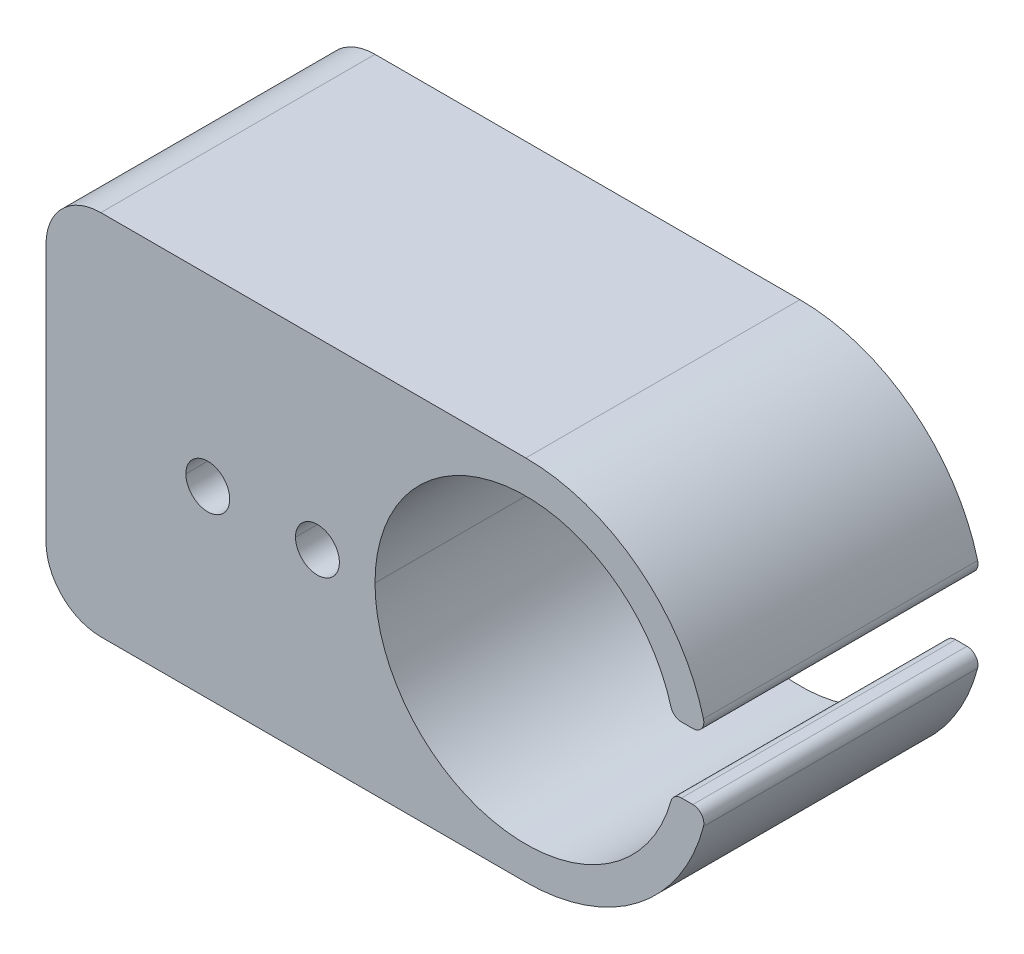
ISO-10303-21;
HEADER;
FILE_DESCRIPTION(('STEP AP214'),'2;1');
FILE_NAME('part.step','',(''),(''),'','','');
FILE_SCHEMA(('AUTOMOTIVE_DESIGN { 1 0 10303 214 1 1 1 1 }'));
ENDSEC;
DATA;
#1=APPLICATION_CONTEXT('core data for automotive mechanical design processes');
#2=APPLICATION_PROTOCOL_DEFINITION('international standard','automotive_design',2000,#1);
#3=PRODUCT_CONTEXT('',#1,'mechanical');
#4=PRODUCT('Part','Part','',(#3));
#5=PRODUCT_RELATED_PRODUCT_CATEGORY('part','',(#4));
#6=PRODUCT_DEFINITION_FORMATION('','',#4);
#7=PRODUCT_DEFINITION_CONTEXT('part definition',#1,'design');
#8=PRODUCT_DEFINITION('design','',#6,#7);
#9=PRODUCT_DEFINITION_SHAPE('','',#8);
#10=(LENGTH_UNIT() NAMED_UNIT(*) SI_UNIT(.MILLI.,.METRE.));
#11=(NAMED_UNIT(*) PLANE_ANGLE_UNIT() SI_UNIT($,.RADIAN.));
#12=(NAMED_UNIT(*) SI_UNIT($,.STERADIAN.) SOLID_ANGLE_UNIT());
#13=UNCERTAINTY_MEASURE_WITH_UNIT(LENGTH_MEASURE(1.E-05),#10,'distance_accuracy_value','');
#14=(GEOMETRIC_REPRESENTATION_CONTEXT(3) GLOBAL_UNCERTAINTY_ASSIGNED_CONTEXT((#13)) GLOBAL_UNIT_ASSIGNED_CONTEXT((#10,
#11,#12)) REPRESENTATION_CONTEXT('',''));
#15=CARTESIAN_POINT('',(0.,0.,0.));
#16=DIRECTION('',(0.,0.,1.));
#17=DIRECTION('',(1.,0.,0.));
#18=AXIS2_PLACEMENT_3D('',#15,#16,#17);
#19=CARTESIAN_POINT('',(14.1972708645007,4.,25.));
#20=DIRECTION('',(0.,0.,-1.));
#21=DIRECTION('',(-1.,0.,0.));
#22=AXIS2_PLACEMENT_3D('',#19,#20,#21);
#23=CYLINDRICAL_SURFACE('',#22,1.);
#24=CARTESIAN_POINT('',(14.1972708645007,4.,25.));
#25=DIRECTION('',(0.,0.,1.));
#26=DIRECTION('',(1.,0.,0.));
#27=AXIS2_PLACEMENT_3D('',#24,#25,#26);
#28=CIRCLE('',#27,1.);
#29=CARTESIAN_POINT('',(13.2347440262294,3.72881355932204,25.));
#30=VERTEX_POINT('',#29);
#31=CARTESIAN_POINT('',(14.1972708645007,3.,25.));
#32=VERTEX_POINT('',#31);
#33=EDGE_CURVE('E337',#30,#32,#28,.T.);
#34=ORIENTED_EDGE('',*,*,#33,.F.);
#35=DIRECTION('',(0.,0.,1.));
#36=VECTOR('',#35,1.);
#37=CARTESIAN_POINT('',(13.2347440262294,3.72881355932204,25.));
#38=LINE('',#37,#36);
#39=CARTESIAN_POINT('',(13.2347440262294,3.72881355932204,0.));
#40=VERTEX_POINT('',#39);
#41=EDGE_CURVE('E293',#40,#30,#38,.T.);
#42=ORIENTED_EDGE('',*,*,#41,.F.);
#43=CARTESIAN_POINT('',(14.1972708645007,4.,0.));
#44=DIRECTION('',(0.,0.,-1.));
#45=DIRECTION('',(1.,0.,0.));
#46=AXIS2_PLACEMENT_3D('',#43,#44,#45);
#47=CIRCLE('',#46,1.);
#48=CARTESIAN_POINT('',(14.1972708645007,3.,0.));
#49=VERTEX_POINT('',#48);
#50=EDGE_CURVE('E383',#49,#40,#47,.T.);
#51=ORIENTED_EDGE('',*,*,#50,.F.);
#52=DIRECTION('',(0.,0.,-1.));
#53=VECTOR('',#52,1.);
#54=CARTESIAN_POINT('',(14.1972708645007,3.,25.));
#55=LINE('',#54,#53);
#56=EDGE_CURVE('E52',#32,#49,#55,.T.);
#57=ORIENTED_EDGE('',*,*,#56,.F.);
#58=EDGE_LOOP('',(#34,#42,#51,#57));
#59=FACE_BOUND('',#58,.T.);
#60=ADVANCED_FACE('F17',(#59),#23,.T.);
#61=CARTESIAN_POINT('',(14.1972708645007,-4.,25.));
#62=DIRECTION('',(0.,0.,-1.));
#63=DIRECTION('',(-1.,0.,0.));
#64=AXIS2_PLACEMENT_3D('',#61,#62,#63);
#65=CYLINDRICAL_SURFACE('',#64,1.);
#66=CARTESIAN_POINT('',(14.1972708645007,-4.,25.));
#67=DIRECTION('',(0.,0.,1.));
#68=DIRECTION('',(1.,0.,0.));
#69=AXIS2_PLACEMENT_3D('',#66,#67,#68);
#70=CIRCLE('',#69,1.);
#71=CARTESIAN_POINT('',(14.1972708645007,-3.,25.));
#72=VERTEX_POINT('',#71);
#73=CARTESIAN_POINT('',(13.2347440262294,-3.72881355932204,25.));
#74=VERTEX_POINT('',#73);
#75=EDGE_CURVE('E374',#72,#74,#70,.T.);
#76=ORIENTED_EDGE('',*,*,#75,.F.);
#77=DIRECTION('',(0.,0.,1.));
#78=VECTOR('',#77,1.);
#79=CARTESIAN_POINT('',(14.1972708645007,-3.,25.));
#80=LINE('',#79,#78);
#81=CARTESIAN_POINT('',(14.1972708645007,-3.,0.));
#82=VERTEX_POINT('',#81);
#83=EDGE_CURVE('E21',#82,#72,#80,.T.);
#84=ORIENTED_EDGE('',*,*,#83,.F.);
#85=CARTESIAN_POINT('',(14.1972708645007,-4.,0.));
#86=DIRECTION('',(0.,0.,-1.));
#87=DIRECTION('',(1.,0.,0.));
#88=AXIS2_PLACEMENT_3D('',#85,#86,#87);
#89=CIRCLE('',#88,1.);
#90=CARTESIAN_POINT('',(13.2347440262294,-3.72881355932204,0.));
#91=VERTEX_POINT('',#90);
#92=EDGE_CURVE('E443',#91,#82,#89,.T.);
#93=ORIENTED_EDGE('',*,*,#92,.F.);
#94=DIRECTION('',(0.,0.,-1.));
#95=VECTOR('',#94,1.);
#96=CARTESIAN_POINT('',(13.2347440262294,-3.72881355932204,25.));
#97=LINE('',#96,#95);
#98=EDGE_CURVE('E41',#74,#91,#97,.T.);
#99=ORIENTED_EDGE('',*,*,#98,.F.);
#100=EDGE_LOOP('',(#76,#84,#93,#99));
#101=FACE_BOUND('',#100,.T.);
#102=ADVANCED_FACE('F508',(#101),#65,.T.);
#103=CARTESIAN_POINT('',(15.2335977365821,4.,25.));
#104=DIRECTION('',(0.,0.,-1.));
#105=DIRECTION('',(-1.,0.,0.));
#106=AXIS2_PLACEMENT_3D('',#103,#104,#105);
#107=CYLINDRICAL_SURFACE('',#106,1.);
#108=CARTESIAN_POINT('',(15.2335977365821,4.,25.));
#109=DIRECTION('',(0.,0.,1.));
#110=DIRECTION('',(1.,0.,0.));
#111=AXIS2_PLACEMENT_3D('',#108,#109,#110);
#112=CIRCLE('',#111,1.);
#113=CARTESIAN_POINT('',(15.2335977365821,3.,25.));
#114=VERTEX_POINT('',#113);
#115=CARTESIAN_POINT('',(16.2008102912857,4.25396825396826,25.));
#116=VERTEX_POINT('',#115);
#117=EDGE_CURVE('E336',#114,#116,#112,.T.);
#118=ORIENTED_EDGE('',*,*,#117,.F.);
#119=DIRECTION('',(0.,0.,1.));
#120=VECTOR('',#119,1.);
#121=CARTESIAN_POINT('',(15.2335977365821,3.,25.));
#122=LINE('',#121,#120);
#123=CARTESIAN_POINT('',(15.2335977365821,3.,0.));
#124=VERTEX_POINT('',#123);
#125=EDGE_CURVE('E344',#124,#114,#122,.T.);
#126=ORIENTED_EDGE('',*,*,#125,.F.);
#127=CARTESIAN_POINT('',(15.2335977365821,4.,0.));
#128=DIRECTION('',(0.,0.,-1.));
#129=DIRECTION('',(1.,0.,0.));
#130=AXIS2_PLACEMENT_3D('',#127,#128,#129);
#131=CIRCLE('',#130,1.);
#132=CARTESIAN_POINT('',(16.2008102912857,4.25396825396826,0.));
#133=VERTEX_POINT('',#132);
#134=EDGE_CURVE('E319',#133,#124,#131,.T.);
#135=ORIENTED_EDGE('',*,*,#134,.F.);
#136=DIRECTION('',(0.,0.,-1.));
#137=VECTOR('',#136,1.);
#138=CARTESIAN_POINT('',(16.2008102912857,4.25396825396826,25.));
#139=LINE('',#138,#137);
#140=EDGE_CURVE('E453',#116,#133,#139,.T.);
#141=ORIENTED_EDGE('',*,*,#140,.F.);
#142=EDGE_LOOP('',(#118,#126,#135,#141));
#143=FACE_BOUND('',#142,.T.);
#144=ADVANCED_FACE('F521',(#143),#107,.T.);
#145=CARTESIAN_POINT('',(15.2335977365821,-4.,25.));
#146=DIRECTION('',(0.,0.,-1.));
#147=DIRECTION('',(-1.,0.,0.));
#148=AXIS2_PLACEMENT_3D('',#145,#146,#147);
#149=CYLINDRICAL_SURFACE('',#148,1.);
#150=CARTESIAN_POINT('',(15.2335977365821,-4.,25.));
#151=DIRECTION('',(0.,0.,1.));
#152=DIRECTION('',(1.,0.,0.));
#153=AXIS2_PLACEMENT_3D('',#150,#151,#152);
#154=CIRCLE('',#153,1.);
#155=CARTESIAN_POINT('',(16.2008102912857,-4.25396825396826,25.));
#156=VERTEX_POINT('',#155);
#157=CARTESIAN_POINT('',(15.2335977365821,-3.,25.));
#158=VERTEX_POINT('',#157);
#159=EDGE_CURVE('E362',#156,#158,#154,.T.);
#160=ORIENTED_EDGE('',*,*,#159,.F.);
#161=DIRECTION('',(0.,0.,1.));
#162=VECTOR('',#161,1.);
#163=CARTESIAN_POINT('',(16.2008102912857,-4.25396825396826,25.));
#164=LINE('',#163,#162);
#165=CARTESIAN_POINT('',(16.2008102912857,-4.25396825396826,0.));
#166=VERTEX_POINT('',#165);
#167=EDGE_CURVE('E405',#166,#156,#164,.T.);
#168=ORIENTED_EDGE('',*,*,#167,.F.);
#169=CARTESIAN_POINT('',(15.2335977365821,-4.,0.));
#170=DIRECTION('',(0.,0.,-1.));
#171=DIRECTION('',(1.,0.,0.));
#172=AXIS2_PLACEMENT_3D('',#169,#170,#171);
#173=CIRCLE('',#172,1.);
#174=CARTESIAN_POINT('',(15.2335977365821,-3.,0.));
#175=VERTEX_POINT('',#174);
#176=EDGE_CURVE('E419',#175,#166,#173,.T.);
#177=ORIENTED_EDGE('',*,*,#176,.F.);
#178=DIRECTION('',(0.,0.,-1.));
#179=VECTOR('',#178,1.);
#180=CARTESIAN_POINT('',(15.2335977365821,-3.,25.));
#181=LINE('',#180,#179);
#182=EDGE_CURVE('E402',#158,#175,#181,.T.);
#183=ORIENTED_EDGE('',*,*,#182,.F.);
#184=EDGE_LOOP('',(#160,#168,#177,#183));
#185=FACE_BOUND('',#184,.T.);
#186=ADVANCED_FACE('F19',(#185),#149,.T.);
#187=CARTESIAN_POINT('',(-38.75,11.75,25.));
#188=DIRECTION('',(0.,0.,-1.));
#189=DIRECTION('',(-1.,0.,0.));
#190=AXIS2_PLACEMENT_3D('',#187,#188,#189);
#191=CYLINDRICAL_SURFACE('',#190,5.);
#192=CARTESIAN_POINT('',(-38.75,11.75,25.));
#193=DIRECTION('',(0.,0.,1.));
#194=DIRECTION('',(1.,0.,0.));
#195=AXIS2_PLACEMENT_3D('',#192,#193,#194);
#196=CIRCLE('',#195,5.);
#197=CARTESIAN_POINT('',(-38.75,16.75,25.));
#198=VERTEX_POINT('',#197);
#199=CARTESIAN_POINT('',(-43.75,11.75,25.));
#200=VERTEX_POINT('',#199);
#201=EDGE_CURVE('E351',#198,#200,#196,.T.);
#202=ORIENTED_EDGE('',*,*,#201,.F.);
#203=DIRECTION('',(0.,0.,1.));
#204=VECTOR('',#203,1.);
#205=CARTESIAN_POINT('',(-38.75,16.75,25.));
#206=LINE('',#205,#204);
#207=CARTESIAN_POINT('',(-38.75,16.75,0.));
#208=VERTEX_POINT('',#207);
#209=EDGE_CURVE('E458',#208,#198,#206,.T.);
#210=ORIENTED_EDGE('',*,*,#209,.F.);
#211=CARTESIAN_POINT('',(-38.75,11.75,0.));
#212=DIRECTION('',(0.,0.,-1.));
#213=DIRECTION('',(1.,0.,0.));
#214=AXIS2_PLACEMENT_3D('',#211,#212,#213);
#215=CIRCLE('',#214,5.);
#216=CARTESIAN_POINT('',(-43.75,11.75,0.));
#217=VERTEX_POINT('',#216);
#218=EDGE_CURVE('E331',#217,#208,#215,.T.);
#219=ORIENTED_EDGE('',*,*,#218,.F.);
#220=DIRECTION('',(0.,0.,-1.));
#221=VECTOR('',#220,1.);
#222=CARTESIAN_POINT('',(-43.75,11.75,25.));
#223=LINE('',#222,#221);
#224=EDGE_CURVE('E457',#200,#217,#223,.T.);
#225=ORIENTED_EDGE('',*,*,#224,.F.);
#226=EDGE_LOOP('',(#202,#210,#219,#225));
#227=FACE_BOUND('',#226,.T.);
#228=ADVANCED_FACE('F533',(#227),#191,.T.);
#229=CARTESIAN_POINT('',(-38.75,-11.75,25.));
#230=DIRECTION('',(0.,0.,-1.));
#231=DIRECTION('',(-1.,0.,0.));
#232=AXIS2_PLACEMENT_3D('',#229,#230,#231);
#233=CYLINDRICAL_SURFACE('',#232,5.);
#234=CARTESIAN_POINT('',(-38.75,-11.75,25.));
#235=DIRECTION('',(0.,0.,1.));
#236=DIRECTION('',(1.,0.,0.));
#237=AXIS2_PLACEMENT_3D('',#234,#235,#236);
#238=CIRCLE('',#237,5.);
#239=CARTESIAN_POINT('',(-43.75,-11.75,25.));
#240=VERTEX_POINT('',#239);
#241=CARTESIAN_POINT('',(-38.75,-16.75,25.));
#242=VERTEX_POINT('',#241);
#243=EDGE_CURVE('E375',#240,#242,#238,.T.);
#244=ORIENTED_EDGE('',*,*,#243,.F.);
#245=DIRECTION('',(0.,0.,1.));
#246=VECTOR('',#245,1.);
#247=CARTESIAN_POINT('',(-43.75,-11.75,25.));
#248=LINE('',#247,#246);
#249=CARTESIAN_POINT('',(-43.75,-11.75,0.));
#250=VERTEX_POINT('',#249);
#251=EDGE_CURVE('E454',#250,#240,#248,.T.);
#252=ORIENTED_EDGE('',*,*,#251,.F.);
#253=CARTESIAN_POINT('',(-38.75,-11.75,0.));
#254=DIRECTION('',(0.,0.,-1.));
#255=DIRECTION('',(1.,0.,0.));
#256=AXIS2_PLACEMENT_3D('',#253,#254,#255);
#257=CIRCLE('',#256,5.);
#258=CARTESIAN_POINT('',(-38.75,-16.75,0.));
#259=VERTEX_POINT('',#258);
#260=EDGE_CURVE('E282',#259,#250,#257,.T.);
#261=ORIENTED_EDGE('',*,*,#260,.F.);
#262=DIRECTION('',(0.,0.,-1.));
#263=VECTOR('',#262,1.);
#264=CARTESIAN_POINT('',(-38.75,-16.75,25.));
#265=LINE('',#264,#263);
#266=EDGE_CURVE('E471',#242,#259,#265,.T.);
#267=ORIENTED_EDGE('',*,*,#266,.F.);
#268=EDGE_LOOP('',(#244,#252,#261,#267));
#269=FACE_BOUND('',#268,.T.);
#270=ADVANCED_FACE('F539',(#269),#233,.T.);
#271=CARTESIAN_POINT('',(-33.75,0.,7.5));
#272=DIRECTION('',(-1.,0.,0.));
#273=DIRECTION('',(0.,0.,1.));
#274=AXIS2_PLACEMENT_3D('',#271,#272,#273);
#275=PLANE('',#274);
#276=CARTESIAN_POINT('',(-33.75,0.,7.5));
#277=DIRECTION('',(-1.,0.,0.));
#278=DIRECTION('',(0.,0.,1.));
#279=AXIS2_PLACEMENT_3D('',#276,#277,#278);
#280=CIRCLE('',#279,2.);
#281=CARTESIAN_POINT('',(-33.75,0.,9.5));
#282=VERTEX_POINT('',#281);
#283=CARTESIAN_POINT('',(-33.75,0.,5.5));
#284=VERTEX_POINT('',#283);
#285=EDGE_CURVE('E11',#282,#284,#280,.T.);
#286=ORIENTED_EDGE('',*,*,#285,.T.);
#287=CARTESIAN_POINT('',(-33.75,0.,7.5));
#288=DIRECTION('',(-1.,0.,0.));
#289=DIRECTION('',(0.,0.,1.));
#290=AXIS2_PLACEMENT_3D('',#287,#288,#289);
#291=CIRCLE('',#290,2.);
#292=EDGE_CURVE('E232',#284,#282,#291,.T.);
#293=ORIENTED_EDGE('',*,*,#292,.T.);
#294=EDGE_LOOP('',(#286,#293));
#295=FACE_BOUND('',#294,.T.);
#296=ADVANCED_FACE('F230',(#295),#275,.T.);
#297=CARTESIAN_POINT('',(-33.75,0.,7.5));
#298=DIRECTION('',(-1.,0.,0.));
#299=DIRECTION('',(0.,0.,1.));
#300=AXIS2_PLACEMENT_3D('',#297,#298,#299);
#301=CYLINDRICAL_SURFACE('',#300,2.);
#302=DIRECTION('',(-1.,0.,0.));
#303=VECTOR('',#302,1.);
#304=CARTESIAN_POINT('',(-33.75,0.,5.5));
#305=LINE('',#304,#303);
#306=CARTESIAN_POINT('',(-43.75,0.,5.5));
#307=VERTEX_POINT('',#306);
#308=EDGE_CURVE('E237',#284,#307,#305,.T.);
#309=ORIENTED_EDGE('',*,*,#308,.F.);
#310=ORIENTED_EDGE('',*,*,#285,.F.);
#311=DIRECTION('',(-1.,0.,0.));
#312=VECTOR('',#311,1.);
#313=CARTESIAN_POINT('',(-33.75,0.,9.5));
#314=LINE('',#313,#312);
#315=CARTESIAN_POINT('',(-43.75,0.,9.5));
#316=VERTEX_POINT('',#315);
#317=EDGE_CURVE('E247',#282,#316,#314,.T.);
#318=ORIENTED_EDGE('',*,*,#317,.T.);
#319=CARTESIAN_POINT('',(-43.75,0.,7.5));
#320=DIRECTION('',(-1.,0.,0.));
#321=DIRECTION('',(0.,0.,1.));
#322=AXIS2_PLACEMENT_3D('',#319,#320,#321);
#323=CIRCLE('',#322,2.);
#324=EDGE_CURVE('E239',#316,#307,#323,.T.);
#325=ORIENTED_EDGE('',*,*,#324,.T.);
#326=EDGE_LOOP('',(#309,#310,#318,#325));
#327=FACE_BOUND('',#326,.T.);
#328=ADVANCED_FACE('F238',(#327),#301,.F.);
#329=CARTESIAN_POINT('',(-33.75,0.,17.5));
#330=DIRECTION('',(-1.,0.,0.));
#331=DIRECTION('',(0.,0.,1.));
#332=AXIS2_PLACEMENT_3D('',#329,#330,#331);
#333=PLANE('',#332);
#334=CARTESIAN_POINT('',(-33.75,0.,17.5));
#335=DIRECTION('',(-1.,0.,0.));
#336=DIRECTION('',(0.,0.,1.));
#337=AXIS2_PLACEMENT_3D('',#334,#335,#336);
#338=CIRCLE('',#337,2.);
#339=CARTESIAN_POINT('',(-33.75,0.,19.5));
#340=VERTEX_POINT('',#339);
#341=CARTESIAN_POINT('',(-33.75,0.,15.5));
#342=VERTEX_POINT('',#341);
#343=EDGE_CURVE('E27',#340,#342,#338,.T.);
#344=ORIENTED_EDGE('',*,*,#343,.T.);
#345=CARTESIAN_POINT('',(-33.75,0.,17.5));
#346=DIRECTION('',(-1.,0.,0.));
#347=DIRECTION('',(0.,0.,1.));
#348=AXIS2_PLACEMENT_3D('',#345,#346,#347);
#349=CIRCLE('',#348,2.);
#350=EDGE_CURVE('E267',#342,#340,#349,.T.);
#351=ORIENTED_EDGE('',*,*,#350,.T.);
#352=EDGE_LOOP('',(#344,#351));
#353=FACE_BOUND('',#352,.T.);
#354=ADVANCED_FACE('F558',(#353),#333,.T.);
#355=CARTESIAN_POINT('',(-33.75,0.,17.5));
#356=DIRECTION('',(-1.,0.,0.));
#357=DIRECTION('',(0.,0.,1.));
#358=AXIS2_PLACEMENT_3D('',#355,#356,#357);
#359=CYLINDRICAL_SURFACE('',#358,2.);
#360=DIRECTION('',(-1.,0.,0.));
#361=VECTOR('',#360,1.);
#362=CARTESIAN_POINT('',(-33.75,0.,15.5));
#363=LINE('',#362,#361);
#364=CARTESIAN_POINT('',(-43.75,0.,15.5));
#365=VERTEX_POINT('',#364);
#366=EDGE_CURVE('E270',#342,#365,#363,.T.);
#367=ORIENTED_EDGE('',*,*,#366,.F.);
#368=ORIENTED_EDGE('',*,*,#343,.F.);
#369=DIRECTION('',(-1.,0.,0.));
#370=VECTOR('',#369,1.);
#371=CARTESIAN_POINT('',(-33.75,0.,19.5));
#372=LINE('',#371,#370);
#373=CARTESIAN_POINT('',(-43.75,0.,19.5));
#374=VERTEX_POINT('',#373);
#375=EDGE_CURVE('E281',#340,#374,#372,.T.);
#376=ORIENTED_EDGE('',*,*,#375,.T.);
#377=CARTESIAN_POINT('',(-43.75,0.,17.5));
#378=DIRECTION('',(-1.,0.,0.));
#379=DIRECTION('',(0.,0.,1.));
#380=AXIS2_PLACEMENT_3D('',#377,#378,#379);
#381=CIRCLE('',#380,2.);
#382=EDGE_CURVE('E468',#374,#365,#381,.T.);
#383=ORIENTED_EDGE('',*,*,#382,.T.);
#384=EDGE_LOOP('',(#367,#368,#376,#383));
#385=FACE_BOUND('',#384,.T.);
#386=ADVANCED_FACE('F561',(#385),#359,.F.);
#387=CARTESIAN_POINT('',(-19.,0.,25.));
#388=DIRECTION('',(0.,0.,-1.));
#389=DIRECTION('',(-1.,0.,0.));
#390=AXIS2_PLACEMENT_3D('',#387,#388,#389);
#391=CYLINDRICAL_SURFACE('',#390,2.);
#392=DIRECTION('',(0.,0.,-1.));
#393=VECTOR('',#392,1.);
#394=CARTESIAN_POINT('',(-17.,0.,25.));
#395=LINE('',#394,#393);
#396=CARTESIAN_POINT('',(-17.,0.,25.));
#397=VERTEX_POINT('',#396);
#398=CARTESIAN_POINT('',(-17.,0.,0.));
#399=VERTEX_POINT('',#398);
#400=EDGE_CURVE('E292',#397,#399,#395,.T.);
#401=ORIENTED_EDGE('',*,*,#400,.F.);
#402=CARTESIAN_POINT('',(-19.,0.,25.));
#403=DIRECTION('',(0.,0.,1.));
#404=DIRECTION('',(1.,0.,0.));
#405=AXIS2_PLACEMENT_3D('',#402,#403,#404);
#406=CIRCLE('',#405,2.);
#407=CARTESIAN_POINT('',(-21.,0.,25.));
#408=VERTEX_POINT('',#407);
#409=EDGE_CURVE('E257',#397,#408,#406,.T.);
#410=ORIENTED_EDGE('',*,*,#409,.T.);
#411=DIRECTION('',(0.,0.,-1.));
#412=VECTOR('',#411,1.);
#413=CARTESIAN_POINT('',(-21.,0.,25.));
#414=LINE('',#413,#412);
#415=CARTESIAN_POINT('',(-21.,0.,0.));
#416=VERTEX_POINT('',#415);
#417=EDGE_CURVE('E259',#408,#416,#414,.T.);
#418=ORIENTED_EDGE('',*,*,#417,.T.);
#419=CARTESIAN_POINT('',(-19.,0.,0.));
#420=DIRECTION('',(0.,0.,1.));
#421=DIRECTION('',(1.,0.,0.));
#422=AXIS2_PLACEMENT_3D('',#419,#420,#421);
#423=CIRCLE('',#422,2.);
#424=EDGE_CURVE('E412',#399,#416,#423,.T.);
#425=ORIENTED_EDGE('',*,*,#424,.F.);
#426=EDGE_LOOP('',(#401,#410,#418,#425));
#427=FACE_BOUND('',#426,.T.);
#428=ADVANCED_FACE('F565',(#427),#391,.F.);
#429=CARTESIAN_POINT('',(-29.,0.,25.));
#430=DIRECTION('',(0.,0.,-1.));
#431=DIRECTION('',(-1.,0.,0.));
#432=AXIS2_PLACEMENT_3D('',#429,#430,#431);
#433=CYLINDRICAL_SURFACE('',#432,2.);
#434=DIRECTION('',(0.,0.,-1.));
#435=VECTOR('',#434,1.);
#436=CARTESIAN_POINT('',(-27.,0.,25.));
#437=LINE('',#436,#435);
#438=CARTESIAN_POINT('',(-27.,0.,25.));
#439=VERTEX_POINT('',#438);
#440=CARTESIAN_POINT('',(-27.,0.,0.));
#441=VERTEX_POINT('',#440);
#442=EDGE_CURVE('E314',#439,#441,#437,.T.);
#443=ORIENTED_EDGE('',*,*,#442,.F.);
#444=CARTESIAN_POINT('',(-29.,0.,25.));
#445=DIRECTION('',(0.,0.,1.));
#446=DIRECTION('',(1.,0.,0.));
#447=AXIS2_PLACEMENT_3D('',#444,#445,#446);
#448=CIRCLE('',#447,2.);
#449=CARTESIAN_POINT('',(-31.,0.,25.));
#450=VERTEX_POINT('',#449);
#451=EDGE_CURVE('E254',#439,#450,#448,.T.);
#452=ORIENTED_EDGE('',*,*,#451,.T.);
#453=DIRECTION('',(0.,0.,-1.));
#454=VECTOR('',#453,1.);
#455=CARTESIAN_POINT('',(-31.,0.,25.));
#456=LINE('',#455,#454);
#457=CARTESIAN_POINT('',(-31.,0.,0.));
#458=VERTEX_POINT('',#457);
#459=EDGE_CURVE('E304',#450,#458,#456,.T.);
#460=ORIENTED_EDGE('',*,*,#459,.T.);
#461=CARTESIAN_POINT('',(-29.,0.,0.));
#462=DIRECTION('',(0.,0.,1.));
#463=DIRECTION('',(1.,0.,0.));
#464=AXIS2_PLACEMENT_3D('',#461,#462,#463);
#465=CIRCLE('',#464,2.);
#466=EDGE_CURVE('E415',#441,#458,#465,.T.);
#467=ORIENTED_EDGE('',*,*,#466,.F.);
#468=EDGE_LOOP('',(#443,#452,#460,#467));
#469=FACE_BOUND('',#468,.T.);
#470=ADVANCED_FACE('F567',(#469),#433,.F.);
#471=CARTESIAN_POINT('',(16.479153497677,-3.,25.));
#472=DIRECTION('',(0.,-1.,0.));
#473=DIRECTION('',(0.,0.,-1.));
#474=AXIS2_PLACEMENT_3D('',#471,#472,#473);
#475=PLANE('',#474);
#476=DIRECTION('',(-1.,0.,0.));
#477=VECTOR('',#476,1.);
#478=CARTESIAN_POINT('',(16.479153497677,-3.,25.));
#479=LINE('',#478,#477);
#480=EDGE_CURVE('E370',#158,#72,#479,.T.);
#481=ORIENTED_EDGE('',*,*,#480,.F.);
#482=ORIENTED_EDGE('',*,*,#182,.T.);
#483=DIRECTION('',(-1.,0.,0.));
#484=VECTOR('',#483,1.);
#485=CARTESIAN_POINT('',(16.479153497677,-3.,0.));
#486=LINE('',#485,#484);
#487=EDGE_CURVE('E411',#175,#82,#486,.T.);
#488=ORIENTED_EDGE('',*,*,#487,.T.);
#489=ORIENTED_EDGE('',*,*,#83,.T.);
#490=EDGE_LOOP('',(#481,#482,#488,#489));
#491=FACE_BOUND('',#490,.T.);
#492=ADVANCED_FACE('F504',(#491),#475,.F.);
#493=CARTESIAN_POINT('',(0.,0.,25.));
#494=DIRECTION('',(0.,0.,-1.));
#495=DIRECTION('',(-1.,0.,0.));
#496=AXIS2_PLACEMENT_3D('',#493,#494,#495);
#497=CYLINDRICAL_SURFACE('',#496,16.75);
#498=CARTESIAN_POINT('',(0.,0.,0.));
#499=DIRECTION('',(0.,0.,1.));
#500=DIRECTION('',(-1.,0.,0.));
#501=AXIS2_PLACEMENT_3D('',#498,#499,#500);
#502=CIRCLE('',#501,16.75);
#503=CARTESIAN_POINT('',(0.,-16.75,0.));
#504=VERTEX_POINT('',#503);
#505=EDGE_CURVE('E423',#504,#166,#502,.T.);
#506=ORIENTED_EDGE('',*,*,#505,.T.);
#507=ORIENTED_EDGE('',*,*,#167,.T.);
#508=CARTESIAN_POINT('',(0.,0.,25.));
#509=DIRECTION('',(0.,0.,1.));
#510=DIRECTION('',(-1.,0.,0.));
#511=AXIS2_PLACEMENT_3D('',#508,#509,#510);
#512=CIRCLE('',#511,16.75);
#513=CARTESIAN_POINT('',(0.,-16.75,25.));
#514=VERTEX_POINT('',#513);
#515=EDGE_CURVE('E297',#514,#156,#512,.T.);
#516=ORIENTED_EDGE('',*,*,#515,.F.);
#517=DIRECTION('',(0.,0.,-1.));
#518=VECTOR('',#517,1.);
#519=CARTESIAN_POINT('',(0.,-16.75,25.));
#520=LINE('',#519,#518);
#521=EDGE_CURVE('E478',#514,#504,#520,.T.);
#522=ORIENTED_EDGE('',*,*,#521,.T.);
#523=EDGE_LOOP('',(#506,#507,#516,#522));
#524=FACE_BOUND('',#523,.T.);
#525=ADVANCED_FACE('F486',(#524),#497,.T.);
#526=CARTESIAN_POINT('',(0.,-16.75,25.));
#527=DIRECTION('',(0.,1.,0.));
#528=DIRECTION('',(1.,0.,0.));
#529=AXIS2_PLACEMENT_3D('',#526,#527,#528);
#530=PLANE('',#529);
#531=DIRECTION('',(1.,0.,0.));
#532=VECTOR('',#531,1.);
#533=CARTESIAN_POINT('',(0.,-16.75,25.));
#534=LINE('',#533,#532);
#535=EDGE_CURVE('E258',#242,#514,#534,.T.);
#536=ORIENTED_EDGE('',*,*,#535,.F.);
#537=ORIENTED_EDGE('',*,*,#266,.T.);
#538=DIRECTION('',(1.,0.,0.));
#539=VECTOR('',#538,1.);
#540=CARTESIAN_POINT('',(0.,-16.75,0.));
#541=LINE('',#540,#539);
#542=EDGE_CURVE('E287',#259,#504,#541,.T.);
#543=ORIENTED_EDGE('',*,*,#542,.T.);
#544=ORIENTED_EDGE('',*,*,#521,.F.);
#545=EDGE_LOOP('',(#536,#537,#543,#544));
#546=FACE_BOUND('',#545,.T.);
#547=ADVANCED_FACE('F496',(#546),#530,.F.);
#548=CARTESIAN_POINT('',(-43.75,-16.75,25.));
#549=DIRECTION('',(1.,0.,0.));
#550=DIRECTION('',(0.,1.,0.));
#551=AXIS2_PLACEMENT_3D('',#548,#549,#550);
#552=PLANE('',#551);
#553=ORIENTED_EDGE('',*,*,#382,.F.);
#554=CARTESIAN_POINT('',(-43.75,0.,17.5));
#555=DIRECTION('',(-1.,0.,0.));
#556=DIRECTION('',(0.,0.,1.));
#557=AXIS2_PLACEMENT_3D('',#554,#555,#556);
#558=CIRCLE('',#557,2.);
#559=EDGE_CURVE('E274',#365,#374,#558,.T.);
#560=ORIENTED_EDGE('',*,*,#559,.F.);
#561=EDGE_LOOP('',(#553,#560));
#562=FACE_BOUND('',#561,.T.);
#563=ORIENTED_EDGE('',*,*,#324,.F.);
#564=CARTESIAN_POINT('',(-43.75,0.,7.5));
#565=DIRECTION('',(-1.,0.,0.));
#566=DIRECTION('',(0.,0.,1.));
#567=AXIS2_PLACEMENT_3D('',#564,#565,#566);
#568=CIRCLE('',#567,2.);
#569=EDGE_CURVE('E244',#307,#316,#568,.T.);
#570=ORIENTED_EDGE('',*,*,#569,.F.);
#571=EDGE_LOOP('',(#563,#570));
#572=FACE_BOUND('',#571,.T.);
#573=DIRECTION('',(0.,-1.,0.));
#574=VECTOR('',#573,1.);
#575=CARTESIAN_POINT('',(-43.75,-16.75,0.));
#576=LINE('',#575,#574);
#577=EDGE_CURVE('E286',#217,#250,#576,.T.);
#578=ORIENTED_EDGE('',*,*,#577,.T.);
#579=ORIENTED_EDGE('',*,*,#251,.T.);
#580=DIRECTION('',(0.,-1.,0.));
#581=VECTOR('',#580,1.);
#582=CARTESIAN_POINT('',(-43.75,-16.75,25.));
#583=LINE('',#582,#581);
#584=EDGE_CURVE('E366',#200,#240,#583,.T.);
#585=ORIENTED_EDGE('',*,*,#584,.F.);
#586=ORIENTED_EDGE('',*,*,#224,.T.);
#587=EDGE_LOOP('',(#578,#579,#585,#586));
#588=FACE_BOUND('',#587,.T.);
#589=ADVANCED_FACE('F536',(#562,#572,#588),#552,.F.);
#590=CARTESIAN_POINT('',(-43.75,16.75,25.));
#591=DIRECTION('',(0.,-1.,0.));
#592=DIRECTION('',(0.,0.,-1.));
#593=AXIS2_PLACEMENT_3D('',#590,#591,#592);
#594=PLANE('',#593);
#595=DIRECTION('',(-1.,0.,0.));
#596=VECTOR('',#595,1.);
#597=CARTESIAN_POINT('',(-43.75,16.75,0.));
#598=LINE('',#597,#596);
#599=CARTESIAN_POINT('',(0.,16.75,0.));
#600=VERTEX_POINT('',#599);
#601=EDGE_CURVE('E320',#600,#208,#598,.T.);
#602=ORIENTED_EDGE('',*,*,#601,.T.);
#603=ORIENTED_EDGE('',*,*,#209,.T.);
#604=DIRECTION('',(-1.,0.,0.));
#605=VECTOR('',#604,1.);
#606=CARTESIAN_POINT('',(-43.75,16.75,25.));
#607=LINE('',#606,#605);
#608=CARTESIAN_POINT('',(0.,16.75,25.));
#609=VERTEX_POINT('',#608);
#610=EDGE_CURVE('E347',#609,#198,#607,.T.);
#611=ORIENTED_EDGE('',*,*,#610,.F.);
#612=DIRECTION('',(0.,0.,-1.));
#613=VECTOR('',#612,1.);
#614=CARTESIAN_POINT('',(0.,16.75,25.));
#615=LINE('',#614,#613);
#616=EDGE_CURVE('E461',#609,#600,#615,.T.);
#617=ORIENTED_EDGE('',*,*,#616,.T.);
#618=EDGE_LOOP('',(#602,#603,#611,#617));
#619=FACE_BOUND('',#618,.T.);
#620=ADVANCED_FACE('F529',(#619),#594,.F.);
#621=CARTESIAN_POINT('',(0.,0.,25.));
#622=DIRECTION('',(0.,0.,-1.));
#623=DIRECTION('',(-1.,0.,0.));
#624=AXIS2_PLACEMENT_3D('',#621,#622,#623);
#625=CYLINDRICAL_SURFACE('',#624,16.75);
#626=CARTESIAN_POINT('',(0.,0.,25.));
#627=DIRECTION('',(0.,0.,1.));
#628=DIRECTION('',(1.,0.,0.));
#629=AXIS2_PLACEMENT_3D('',#626,#627,#628);
#630=CIRCLE('',#629,16.75);
#631=EDGE_CURVE('E352',#116,#609,#630,.T.);
#632=ORIENTED_EDGE('',*,*,#631,.F.);
#633=ORIENTED_EDGE('',*,*,#140,.T.);
#634=CARTESIAN_POINT('',(0.,0.,0.));
#635=DIRECTION('',(0.,0.,1.));
#636=DIRECTION('',(1.,0.,0.));
#637=AXIS2_PLACEMENT_3D('',#634,#635,#636);
#638=CIRCLE('',#637,16.75);
#639=EDGE_CURVE('E315',#133,#600,#638,.T.);
#640=ORIENTED_EDGE('',*,*,#639,.T.);
#641=ORIENTED_EDGE('',*,*,#616,.F.);
#642=EDGE_LOOP('',(#632,#633,#640,#641));
#643=FACE_BOUND('',#642,.T.);
#644=ADVANCED_FACE('F525',(#643),#625,.T.);
#645=CARTESIAN_POINT('',(13.4187369003196,3.,25.));
#646=DIRECTION('',(0.,1.,0.));
#647=DIRECTION('',(1.,0.,0.));
#648=AXIS2_PLACEMENT_3D('',#645,#646,#647);
#649=PLANE('',#648);
#650=DIRECTION('',(1.,0.,0.));
#651=VECTOR('',#650,1.);
#652=CARTESIAN_POINT('',(13.4187369003196,3.,0.));
#653=LINE('',#652,#651);
#654=EDGE_CURVE('E387',#49,#124,#653,.T.);
#655=ORIENTED_EDGE('',*,*,#654,.T.);
#656=ORIENTED_EDGE('',*,*,#125,.T.);
#657=DIRECTION('',(1.,0.,0.));
#658=VECTOR('',#657,1.);
#659=CARTESIAN_POINT('',(13.4187369003196,3.,25.));
#660=LINE('',#659,#658);
#661=EDGE_CURVE('E332',#32,#114,#660,.T.);
#662=ORIENTED_EDGE('',*,*,#661,.F.);
#663=ORIENTED_EDGE('',*,*,#56,.T.);
#664=EDGE_LOOP('',(#655,#656,#662,#663));
#665=FACE_BOUND('',#664,.T.);
#666=ADVANCED_FACE('F517',(#665),#649,.F.);
#667=CARTESIAN_POINT('',(0.,0.,25.));
#668=DIRECTION('',(0.,0.,-1.));
#669=DIRECTION('',(-1.,0.,0.));
#670=AXIS2_PLACEMENT_3D('',#667,#668,#669);
#671=CYLINDRICAL_SURFACE('',#670,13.75);
#672=DIRECTION('',(0.,0.,-1.));
#673=VECTOR('',#672,1.);
#674=CARTESIAN_POINT('',(-13.75,0.,25.));
#675=LINE('',#674,#673);
#676=CARTESIAN_POINT('',(-13.75,0.,25.));
#677=VERTEX_POINT('',#676);
#678=CARTESIAN_POINT('',(-13.75,0.,0.));
#679=VERTEX_POINT('',#678);
#680=EDGE_CURVE('E303',#677,#679,#675,.T.);
#681=ORIENTED_EDGE('',*,*,#680,.F.);
#682=CARTESIAN_POINT('',(0.,0.,25.));
#683=DIRECTION('',(0.,0.,-1.));
#684=DIRECTION('',(1.,0.,0.));
#685=AXIS2_PLACEMENT_3D('',#682,#683,#684);
#686=CIRCLE('',#685,13.75);
#687=EDGE_CURVE('E382',#74,#677,#686,.T.);
#688=ORIENTED_EDGE('',*,*,#687,.F.);
#689=ORIENTED_EDGE('',*,*,#98,.T.);
#690=CARTESIAN_POINT('',(0.,0.,0.));
#691=DIRECTION('',(0.,0.,-1.));
#692=DIRECTION('',(1.,0.,0.));
#693=AXIS2_PLACEMENT_3D('',#690,#691,#692);
#694=CIRCLE('',#693,13.75);
#695=EDGE_CURVE('E386',#91,#679,#694,.T.);
#696=ORIENTED_EDGE('',*,*,#695,.T.);
#697=EDGE_LOOP('',(#681,#688,#689,#696));
#698=FACE_BOUND('',#697,.T.);
#699=ADVANCED_FACE('F509',(#698),#671,.F.);
#700=CARTESIAN_POINT('',(0.,0.,0.));
#701=DIRECTION('',(0.,0.,1.));
#702=DIRECTION('',(1.,0.,0.));
#703=AXIS2_PLACEMENT_3D('',#700,#701,#702);
#704=PLANE('',#703);
#705=CARTESIAN_POINT('',(-19.,0.,0.));
#706=DIRECTION('',(0.,0.,1.));
#707=DIRECTION('',(1.,0.,0.));
#708=AXIS2_PLACEMENT_3D('',#705,#706,#707);
#709=CIRCLE('',#708,2.);
#710=EDGE_CURVE('E263',#416,#399,#709,.T.);
#711=ORIENTED_EDGE('',*,*,#710,.T.);
#712=ORIENTED_EDGE('',*,*,#424,.T.);
#713=EDGE_LOOP('',(#711,#712));
#714=FACE_BOUND('',#713,.T.);
#715=CARTESIAN_POINT('',(-29.,0.,0.));
#716=DIRECTION('',(0.,0.,1.));
#717=DIRECTION('',(1.,0.,0.));
#718=AXIS2_PLACEMENT_3D('',#715,#716,#717);
#719=CIRCLE('',#718,2.);
#720=EDGE_CURVE('E327',#458,#441,#719,.T.);
#721=ORIENTED_EDGE('',*,*,#720,.T.);
#722=ORIENTED_EDGE('',*,*,#466,.T.);
#723=EDGE_LOOP('',(#721,#722));
#724=FACE_BOUND('',#723,.T.);
#725=ORIENTED_EDGE('',*,*,#487,.F.);
#726=ORIENTED_EDGE('',*,*,#176,.T.);
#727=ORIENTED_EDGE('',*,*,#505,.F.);
#728=ORIENTED_EDGE('',*,*,#542,.F.);
#729=ORIENTED_EDGE('',*,*,#260,.T.);
#730=ORIENTED_EDGE('',*,*,#577,.F.);
#731=ORIENTED_EDGE('',*,*,#218,.T.);
#732=ORIENTED_EDGE('',*,*,#601,.F.);
#733=ORIENTED_EDGE('',*,*,#639,.F.);
#734=ORIENTED_EDGE('',*,*,#134,.T.);
#735=ORIENTED_EDGE('',*,*,#654,.F.);
#736=ORIENTED_EDGE('',*,*,#50,.T.);
#737=CARTESIAN_POINT('',(0.,0.,0.));
#738=DIRECTION('',(0.,0.,-1.));
#739=DIRECTION('',(1.,0.,0.));
#740=AXIS2_PLACEMENT_3D('',#737,#738,#739);
#741=CIRCLE('',#740,13.75);
#742=EDGE_CURVE('E298',#679,#40,#741,.T.);
#743=ORIENTED_EDGE('',*,*,#742,.F.);
#744=ORIENTED_EDGE('',*,*,#695,.F.);
#745=ORIENTED_EDGE('',*,*,#92,.T.);
#746=EDGE_LOOP('',(#725,#726,#727,#728,#729,#730,#731,#732,#733,#734,#735,#736,#743,#744,#745));
#747=FACE_BOUND('',#746,.T.);
#748=ADVANCED_FACE('F501',(#714,#724,#747),#704,.F.);
#749=CARTESIAN_POINT('',(0.,0.,25.));
#750=DIRECTION('',(0.,0.,1.));
#751=DIRECTION('',(1.,0.,0.));
#752=AXIS2_PLACEMENT_3D('',#749,#750,#751);
#753=PLANE('',#752);
#754=CARTESIAN_POINT('',(-19.,0.,25.));
#755=DIRECTION('',(0.,0.,1.));
#756=DIRECTION('',(1.,0.,0.));
#757=AXIS2_PLACEMENT_3D('',#754,#755,#756);
#758=CIRCLE('',#757,2.);
#759=EDGE_CURVE('E288',#408,#397,#758,.T.);
#760=ORIENTED_EDGE('',*,*,#759,.F.);
#761=ORIENTED_EDGE('',*,*,#409,.F.);
#762=EDGE_LOOP('',(#760,#761));
#763=FACE_BOUND('',#762,.T.);
#764=CARTESIAN_POINT('',(-29.,0.,25.));
#765=DIRECTION('',(0.,0.,1.));
#766=DIRECTION('',(1.,0.,0.));
#767=AXIS2_PLACEMENT_3D('',#764,#765,#766);
#768=CIRCLE('',#767,2.);
#769=EDGE_CURVE('E262',#450,#439,#768,.T.);
#770=ORIENTED_EDGE('',*,*,#769,.F.);
#771=ORIENTED_EDGE('',*,*,#451,.F.);
#772=EDGE_LOOP('',(#770,#771));
#773=FACE_BOUND('',#772,.T.);
#774=ORIENTED_EDGE('',*,*,#515,.T.);
#775=ORIENTED_EDGE('',*,*,#159,.T.);
#776=ORIENTED_EDGE('',*,*,#480,.T.);
#777=ORIENTED_EDGE('',*,*,#75,.T.);
#778=ORIENTED_EDGE('',*,*,#687,.T.);
#779=CARTESIAN_POINT('',(0.,0.,25.));
#780=DIRECTION('',(0.,0.,-1.));
#781=DIRECTION('',(1.,0.,0.));
#782=AXIS2_PLACEMENT_3D('',#779,#780,#781);
#783=CIRCLE('',#782,13.75);
#784=EDGE_CURVE('E299',#677,#30,#783,.T.);
#785=ORIENTED_EDGE('',*,*,#784,.T.);
#786=ORIENTED_EDGE('',*,*,#33,.T.);
#787=ORIENTED_EDGE('',*,*,#661,.T.);
#788=ORIENTED_EDGE('',*,*,#117,.T.);
#789=ORIENTED_EDGE('',*,*,#631,.T.);
#790=ORIENTED_EDGE('',*,*,#610,.T.);
#791=ORIENTED_EDGE('',*,*,#201,.T.);
#792=ORIENTED_EDGE('',*,*,#584,.T.);
#793=ORIENTED_EDGE('',*,*,#243,.T.);
#794=ORIENTED_EDGE('',*,*,#535,.T.);
#795=EDGE_LOOP('',(#774,#775,#776,#777,#778,#785,#786,#787,#788,#789,#790,#791,#792,#793,#794));
#796=FACE_BOUND('',#795,.T.);
#797=ADVANCED_FACE('F492',(#763,#773,#796),#753,.T.);
#798=CARTESIAN_POINT('',(0.,0.,25.));
#799=DIRECTION('',(0.,0.,-1.));
#800=DIRECTION('',(-1.,0.,0.));
#801=AXIS2_PLACEMENT_3D('',#798,#799,#800);
#802=CYLINDRICAL_SURFACE('',#801,13.75);
#803=ORIENTED_EDGE('',*,*,#784,.F.);
#804=ORIENTED_EDGE('',*,*,#680,.T.);
#805=ORIENTED_EDGE('',*,*,#742,.T.);
#806=ORIENTED_EDGE('',*,*,#41,.T.);
#807=EDGE_LOOP('',(#803,#804,#805,#806));
#808=FACE_BOUND('',#807,.T.);
#809=ADVANCED_FACE('F513',(#808),#802,.F.);
#810=CARTESIAN_POINT('',(-29.,0.,25.));
#811=DIRECTION('',(0.,0.,-1.));
#812=DIRECTION('',(-1.,0.,0.));
#813=AXIS2_PLACEMENT_3D('',#810,#811,#812);
#814=CYLINDRICAL_SURFACE('',#813,2.);
#815=ORIENTED_EDGE('',*,*,#769,.T.);
#816=ORIENTED_EDGE('',*,*,#442,.T.);
#817=ORIENTED_EDGE('',*,*,#720,.F.);
#818=ORIENTED_EDGE('',*,*,#459,.F.);
#819=EDGE_LOOP('',(#815,#816,#817,#818));
#820=FACE_BOUND('',#819,.T.);
#821=ADVANCED_FACE('F589',(#820),#814,.F.);
#822=CARTESIAN_POINT('',(-19.,0.,25.));
#823=DIRECTION('',(0.,0.,-1.));
#824=DIRECTION('',(-1.,0.,0.));
#825=AXIS2_PLACEMENT_3D('',#822,#823,#824);
#826=CYLINDRICAL_SURFACE('',#825,2.);
#827=ORIENTED_EDGE('',*,*,#759,.T.);
#828=ORIENTED_EDGE('',*,*,#400,.T.);
#829=ORIENTED_EDGE('',*,*,#710,.F.);
#830=ORIENTED_EDGE('',*,*,#417,.F.);
#831=EDGE_LOOP('',(#827,#828,#829,#830));
#832=FACE_BOUND('',#831,.T.);
#833=ADVANCED_FACE('F592',(#832),#826,.F.);
#834=CARTESIAN_POINT('',(-33.75,0.,17.5));
#835=DIRECTION('',(-1.,0.,0.));
#836=DIRECTION('',(0.,0.,1.));
#837=AXIS2_PLACEMENT_3D('',#834,#835,#836);
#838=CYLINDRICAL_SURFACE('',#837,2.);
#839=ORIENTED_EDGE('',*,*,#350,.F.);
#840=ORIENTED_EDGE('',*,*,#366,.T.);
#841=ORIENTED_EDGE('',*,*,#559,.T.);
#842=ORIENTED_EDGE('',*,*,#375,.F.);
#843=EDGE_LOOP('',(#839,#840,#841,#842));
#844=FACE_BOUND('',#843,.T.);
#845=ADVANCED_FACE('F600',(#844),#838,.F.);
#846=CARTESIAN_POINT('',(-33.75,0.,7.5));
#847=DIRECTION('',(-1.,0.,0.));
#848=DIRECTION('',(0.,0.,1.));
#849=AXIS2_PLACEMENT_3D('',#846,#847,#848);
#850=CYLINDRICAL_SURFACE('',#849,2.);
#851=ORIENTED_EDGE('',*,*,#292,.F.);
#852=ORIENTED_EDGE('',*,*,#308,.T.);
#853=ORIENTED_EDGE('',*,*,#569,.T.);
#854=ORIENTED_EDGE('',*,*,#317,.F.);
#855=EDGE_LOOP('',(#851,#852,#853,#854));
#856=FACE_BOUND('',#855,.T.);
#857=ADVANCED_FACE('F246',(#856),#850,.F.);
#858=CLOSED_SHELL('',(#60,#102,#144,#186,#228,#270,#296,#328,#354,#386,#428,#470,#492,#525,#547,
#589,#620,#644,#666,#699,#748,#797,#809,#821,#833,#845,#857));
#859=MANIFOLD_SOLID_BREP('B1',#858);
#860=ADVANCED_BREP_SHAPE_REPRESENTATION('',(#18,#859),#14);
#861=SHAPE_DEFINITION_REPRESENTATION(#9,#860);
ENDSEC;
END-ISO-10303-21;
